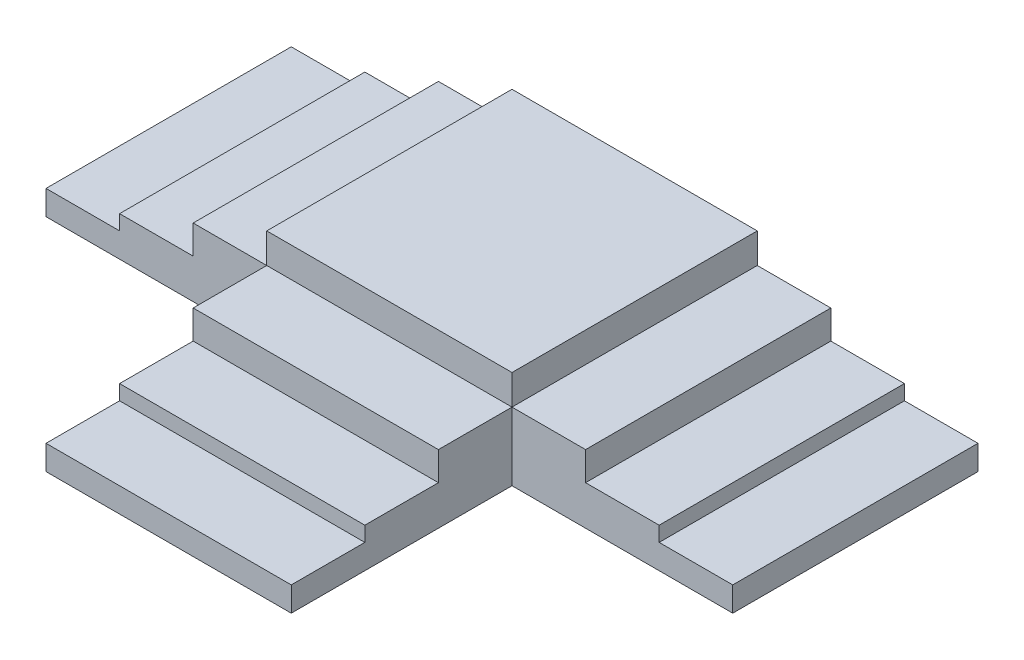
ISO-10303-21;
HEADER;
FILE_DESCRIPTION(('STEP AP214'),'2;1');
FILE_NAME('part.step','',(''),(''),'','','');
FILE_SCHEMA(('AUTOMOTIVE_DESIGN { 1 0 10303 214 1 1 1 1 }'));
ENDSEC;
DATA;
#1=APPLICATION_CONTEXT('core data for automotive mechanical design processes');
#2=APPLICATION_PROTOCOL_DEFINITION('international standard','automotive_design',2000,#1);
#3=PRODUCT_CONTEXT('',#1,'mechanical');
#4=PRODUCT('Part','Part','',(#3));
#5=PRODUCT_RELATED_PRODUCT_CATEGORY('part','',(#4));
#6=PRODUCT_DEFINITION_FORMATION('','',#4);
#7=PRODUCT_DEFINITION_CONTEXT('part definition',#1,'design');
#8=PRODUCT_DEFINITION('design','',#6,#7);
#9=PRODUCT_DEFINITION_SHAPE('','',#8);
#10=(LENGTH_UNIT() NAMED_UNIT(*) SI_UNIT(.MILLI.,.METRE.));
#11=(NAMED_UNIT(*) PLANE_ANGLE_UNIT() SI_UNIT($,.RADIAN.));
#12=(NAMED_UNIT(*) SI_UNIT($,.STERADIAN.) SOLID_ANGLE_UNIT());
#13=UNCERTAINTY_MEASURE_WITH_UNIT(LENGTH_MEASURE(1.E-05),#10,'distance_accuracy_value','');
#14=(GEOMETRIC_REPRESENTATION_CONTEXT(3) GLOBAL_UNCERTAINTY_ASSIGNED_CONTEXT((#13)) GLOBAL_UNIT_ASSIGNED_CONTEXT((#10,
#11,#12)) REPRESENTATION_CONTEXT('',''));
#15=CARTESIAN_POINT('',(0.,0.,0.));
#16=DIRECTION('',(0.,0.,1.));
#17=DIRECTION('',(1.,0.,0.));
#18=AXIS2_PLACEMENT_3D('',#15,#16,#17);
#19=CARTESIAN_POINT('',(500.,400.,-500.));
#20=DIRECTION('',(-1.,0.,0.));
#21=DIRECTION('',(0.,0.,1.));
#22=AXIS2_PLACEMENT_3D('',#19,#20,#21);
#23=PLANE('',#22);
#24=DIRECTION('',(0.,-1.,0.));
#25=VECTOR('',#24,1.);
#26=CARTESIAN_POINT('',(500.,277.753844898,500.));
#27=LINE('',#26,#25);
#28=CARTESIAN_POINT('',(500.,277.753844898,500.));
#29=VERTEX_POINT('',#28);
#30=CARTESIAN_POINT('',(500.,0.,500.));
#31=VERTEX_POINT('',#30);
#32=EDGE_CURVE('E228',#29,#31,#27,.T.);
#33=ORIENTED_EDGE('',*,*,#32,.F.);
#34=DIRECTION('',(0.,0.,1.));
#35=VECTOR('',#34,1.);
#36=CARTESIAN_POINT('',(500.,277.753844898,800.));
#37=LINE('',#36,#35);
#38=CARTESIAN_POINT('',(500.,277.753844898,800.));
#39=VERTEX_POINT('',#38);
#40=EDGE_CURVE('E284',#29,#39,#37,.T.);
#41=ORIENTED_EDGE('',*,*,#40,.T.);
#42=DIRECTION('',(0.,-1.,0.));
#43=VECTOR('',#42,1.);
#44=CARTESIAN_POINT('',(500.,160.85496084446,800.));
#45=LINE('',#44,#43);
#46=CARTESIAN_POINT('',(500.,160.85496084446,800.));
#47=VERTEX_POINT('',#46);
#48=EDGE_CURVE('E281',#39,#47,#45,.T.);
#49=ORIENTED_EDGE('',*,*,#48,.T.);
#50=DIRECTION('',(0.,0.,1.));
#51=VECTOR('',#50,1.);
#52=CARTESIAN_POINT('',(500.,160.85496084446,1100.));
#53=LINE('',#52,#51);
#54=CARTESIAN_POINT('',(500.,160.85496084446,1100.));
#55=VERTEX_POINT('',#54);
#56=EDGE_CURVE('E278',#47,#55,#53,.T.);
#57=ORIENTED_EDGE('',*,*,#56,.T.);
#58=DIRECTION('',(0.,-1.,0.));
#59=VECTOR('',#58,1.);
#60=CARTESIAN_POINT('',(500.,100.,1100.));
#61=LINE('',#60,#59);
#62=CARTESIAN_POINT('',(500.,100.,1100.));
#63=VERTEX_POINT('',#62);
#64=EDGE_CURVE('E275',#55,#63,#61,.T.);
#65=ORIENTED_EDGE('',*,*,#64,.T.);
#66=DIRECTION('',(0.,0.,1.));
#67=VECTOR('',#66,1.);
#68=CARTESIAN_POINT('',(500.,100.,1400.));
#69=LINE('',#68,#67);
#70=CARTESIAN_POINT('',(500.,100.,1400.));
#71=VERTEX_POINT('',#70);
#72=EDGE_CURVE('E271',#63,#71,#69,.T.);
#73=ORIENTED_EDGE('',*,*,#72,.T.);
#74=DIRECTION('',(0.,-1.,0.));
#75=VECTOR('',#74,1.);
#76=CARTESIAN_POINT('',(500.,0.,1400.));
#77=LINE('',#76,#75);
#78=CARTESIAN_POINT('',(500.,0.,1400.));
#79=VERTEX_POINT('',#78);
#80=EDGE_CURVE('E268',#71,#79,#77,.T.);
#81=ORIENTED_EDGE('',*,*,#80,.T.);
#82=DIRECTION('',(0.,0.,-1.));
#83=VECTOR('',#82,1.);
#84=CARTESIAN_POINT('',(500.,0.,-500.));
#85=LINE('',#84,#83);
#86=EDGE_CURVE('E67',#79,#31,#85,.T.);
#87=ORIENTED_EDGE('',*,*,#86,.T.);
#88=EDGE_LOOP('',(#33,#41,#49,#57,#65,#73,#81,#87));
#89=FACE_BOUND('',#88,.T.);
#90=ADVANCED_FACE('F45',(#89),#23,.F.);
#91=DIRECTION('',(0.,0.,1.));
#92=VECTOR('',#91,1.);
#93=CARTESIAN_POINT('',(500.,277.753844898,-1441.88491778753));
#94=LINE('',#93,#92);
#95=CARTESIAN_POINT('',(500.,277.753844898,-500.));
#96=VERTEX_POINT('',#95);
#97=EDGE_CURVE('E60',#96,#29,#94,.T.);
#98=ORIENTED_EDGE('',*,*,#97,.F.);
#99=DIRECTION('',(0.,-1.,0.));
#100=VECTOR('',#99,1.);
#101=CARTESIAN_POINT('',(500.,400.,-500.));
#102=LINE('',#101,#100);
#103=CARTESIAN_POINT('',(500.,400.,-500.));
#104=VERTEX_POINT('',#103);
#105=EDGE_CURVE('E11',#104,#96,#102,.T.);
#106=ORIENTED_EDGE('',*,*,#105,.F.);
#107=DIRECTION('',(0.,0.,-1.));
#108=VECTOR('',#107,1.);
#109=CARTESIAN_POINT('',(500.,400.,-500.));
#110=LINE('',#109,#108);
#111=CARTESIAN_POINT('',(500.,400.,500.));
#112=VERTEX_POINT('',#111);
#113=EDGE_CURVE('E406',#112,#104,#110,.T.);
#114=ORIENTED_EDGE('',*,*,#113,.F.);
#115=DIRECTION('',(0.,-1.,0.));
#116=VECTOR('',#115,1.);
#117=CARTESIAN_POINT('',(500.,400.,500.));
#118=LINE('',#117,#116);
#119=EDGE_CURVE('E420',#112,#29,#118,.T.);
#120=ORIENTED_EDGE('',*,*,#119,.T.);
#121=EDGE_LOOP('',(#98,#106,#114,#120));
#122=FACE_BOUND('',#121,.T.);
#123=ADVANCED_FACE('F537',(#122),#23,.F.);
#124=CARTESIAN_POINT('',(-500.,400.,500.));
#125=DIRECTION('',(0.,0.,-1.));
#126=DIRECTION('',(-1.,0.,0.));
#127=AXIS2_PLACEMENT_3D('',#124,#125,#126);
#128=PLANE('',#127);
#129=DIRECTION('',(0.,-1.,0.));
#130=VECTOR('',#129,1.);
#131=CARTESIAN_POINT('',(-500.,277.753844898,500.));
#132=LINE('',#131,#130);
#133=CARTESIAN_POINT('',(-500.,277.753844898,500.));
#134=VERTEX_POINT('',#133);
#135=CARTESIAN_POINT('',(-500.,0.,500.));
#136=VERTEX_POINT('',#135);
#137=EDGE_CURVE('E288',#134,#136,#132,.T.);
#138=ORIENTED_EDGE('',*,*,#137,.F.);
#139=DIRECTION('',(-1.,0.,0.));
#140=VECTOR('',#139,1.);
#141=CARTESIAN_POINT('',(-800.,277.753844898,500.));
#142=LINE('',#141,#140);
#143=CARTESIAN_POINT('',(-800.,277.753844898,500.));
#144=VERTEX_POINT('',#143);
#145=EDGE_CURVE('E359',#134,#144,#142,.T.);
#146=ORIENTED_EDGE('',*,*,#145,.T.);
#147=DIRECTION('',(0.,-1.,0.));
#148=VECTOR('',#147,1.);
#149=CARTESIAN_POINT('',(-800.,160.85496084446,500.));
#150=LINE('',#149,#148);
#151=CARTESIAN_POINT('',(-800.,160.85496084446,500.));
#152=VERTEX_POINT('',#151);
#153=EDGE_CURVE('E356',#144,#152,#150,.T.);
#154=ORIENTED_EDGE('',*,*,#153,.T.);
#155=DIRECTION('',(-1.,0.,0.));
#156=VECTOR('',#155,1.);
#157=CARTESIAN_POINT('',(-1100.,160.85496084446,500.));
#158=LINE('',#157,#156);
#159=CARTESIAN_POINT('',(-1100.,160.85496084446,500.));
#160=VERTEX_POINT('',#159);
#161=EDGE_CURVE('E353',#152,#160,#158,.T.);
#162=ORIENTED_EDGE('',*,*,#161,.T.);
#163=DIRECTION('',(0.,-1.,0.));
#164=VECTOR('',#163,1.);
#165=CARTESIAN_POINT('',(-1100.,100.,500.));
#166=LINE('',#165,#164);
#167=CARTESIAN_POINT('',(-1100.,100.,500.));
#168=VERTEX_POINT('',#167);
#169=EDGE_CURVE('E350',#160,#168,#166,.T.);
#170=ORIENTED_EDGE('',*,*,#169,.T.);
#171=DIRECTION('',(-1.,0.,0.));
#172=VECTOR('',#171,1.);
#173=CARTESIAN_POINT('',(-1400.,100.,500.));
#174=LINE('',#173,#172);
#175=CARTESIAN_POINT('',(-1400.,100.,500.));
#176=VERTEX_POINT('',#175);
#177=EDGE_CURVE('E346',#168,#176,#174,.T.);
#178=ORIENTED_EDGE('',*,*,#177,.T.);
#179=DIRECTION('',(0.,-1.,0.));
#180=VECTOR('',#179,1.);
#181=CARTESIAN_POINT('',(-1400.,0.,500.));
#182=LINE('',#181,#180);
#183=CARTESIAN_POINT('',(-1400.,0.,500.));
#184=VERTEX_POINT('',#183);
#185=EDGE_CURVE('E342',#176,#184,#182,.T.);
#186=ORIENTED_EDGE('',*,*,#185,.T.);
#187=DIRECTION('',(1.,0.,0.));
#188=VECTOR('',#187,1.);
#189=CARTESIAN_POINT('',(-500.,0.,500.));
#190=LINE('',#189,#188);
#191=EDGE_CURVE('E411',#184,#136,#190,.T.);
#192=ORIENTED_EDGE('',*,*,#191,.T.);
#193=EDGE_LOOP('',(#138,#146,#154,#162,#170,#178,#186,#192));
#194=FACE_BOUND('',#193,.T.);
#195=ADVANCED_FACE('F454',(#194),#128,.F.);
#196=DIRECTION('',(-1.,0.,0.));
#197=VECTOR('',#196,1.);
#198=CARTESIAN_POINT('',(1441.88491778753,277.753844898,500.));
#199=LINE('',#198,#197);
#200=EDGE_CURVE('E272',#29,#134,#199,.T.);
#201=ORIENTED_EDGE('',*,*,#200,.F.);
#202=ORIENTED_EDGE('',*,*,#119,.F.);
#203=DIRECTION('',(1.,0.,0.));
#204=VECTOR('',#203,1.);
#205=CARTESIAN_POINT('',(-500.,400.,500.));
#206=LINE('',#205,#204);
#207=CARTESIAN_POINT('',(-500.,400.,500.));
#208=VERTEX_POINT('',#207);
#209=EDGE_CURVE('E417',#208,#112,#206,.T.);
#210=ORIENTED_EDGE('',*,*,#209,.F.);
#211=DIRECTION('',(0.,-1.,0.));
#212=VECTOR('',#211,1.);
#213=CARTESIAN_POINT('',(-500.,400.,500.));
#214=LINE('',#213,#212);
#215=EDGE_CURVE('E429',#208,#134,#214,.T.);
#216=ORIENTED_EDGE('',*,*,#215,.T.);
#217=EDGE_LOOP('',(#201,#202,#210,#216));
#218=FACE_BOUND('',#217,.T.);
#219=ADVANCED_FACE('F486',(#218),#128,.F.);
#220=CARTESIAN_POINT('',(-500.,400.,-500.));
#221=DIRECTION('',(1.,0.,0.));
#222=DIRECTION('',(0.,0.,-1.));
#223=AXIS2_PLACEMENT_3D('',#220,#221,#222);
#224=PLANE('',#223);
#225=DIRECTION('',(0.,0.,-1.));
#226=VECTOR('',#225,1.);
#227=CARTESIAN_POINT('',(-500.,277.753844898,1441.88491778753));
#228=LINE('',#227,#226);
#229=CARTESIAN_POINT('',(-500.,277.753844898,-500.));
#230=VERTEX_POINT('',#229);
#231=EDGE_CURVE('E347',#134,#230,#228,.T.);
#232=ORIENTED_EDGE('',*,*,#231,.F.);
#233=ORIENTED_EDGE('',*,*,#215,.F.);
#234=DIRECTION('',(0.,0.,1.));
#235=VECTOR('',#234,1.);
#236=CARTESIAN_POINT('',(-500.,400.,-500.));
#237=LINE('',#236,#235);
#238=CARTESIAN_POINT('',(-500.,400.,-500.));
#239=VERTEX_POINT('',#238);
#240=EDGE_CURVE('E414',#239,#208,#237,.T.);
#241=ORIENTED_EDGE('',*,*,#240,.F.);
#242=DIRECTION('',(0.,-1.,0.));
#243=VECTOR('',#242,1.);
#244=CARTESIAN_POINT('',(-500.,400.,-500.));
#245=LINE('',#244,#243);
#246=EDGE_CURVE('E53',#239,#230,#245,.T.);
#247=ORIENTED_EDGE('',*,*,#246,.T.);
#248=EDGE_LOOP('',(#232,#233,#241,#247));
#249=FACE_BOUND('',#248,.T.);
#250=ADVANCED_FACE('F437',(#249),#224,.F.);
#251=CARTESIAN_POINT('',(-500.,400.,-500.));
#252=DIRECTION('',(0.,0.,1.));
#253=DIRECTION('',(1.,0.,0.));
#254=AXIS2_PLACEMENT_3D('',#251,#252,#253);
#255=PLANE('',#254);
#256=DIRECTION('',(-1.,0.,0.));
#257=VECTOR('',#256,1.);
#258=CARTESIAN_POINT('',(-500.,0.,-500.));
#259=LINE('',#258,#257);
#260=CARTESIAN_POINT('',(1400.,0.,-500.));
#261=VERTEX_POINT('',#260);
#262=CARTESIAN_POINT('',(-1400.,0.,-500.));
#263=VERTEX_POINT('',#262);
#264=EDGE_CURVE('E208',#261,#263,#259,.T.);
#265=ORIENTED_EDGE('',*,*,#264,.T.);
#266=DIRECTION('',(0.,1.,0.));
#267=VECTOR('',#266,1.);
#268=CARTESIAN_POINT('',(-1400.,0.,-500.));
#269=LINE('',#268,#267);
#270=CARTESIAN_POINT('',(-1400.,100.,-500.));
#271=VERTEX_POINT('',#270);
#272=EDGE_CURVE('E287',#263,#271,#269,.T.);
#273=ORIENTED_EDGE('',*,*,#272,.T.);
#274=DIRECTION('',(1.,0.,0.));
#275=VECTOR('',#274,1.);
#276=CARTESIAN_POINT('',(-1400.,100.,-500.));
#277=LINE('',#276,#275);
#278=CARTESIAN_POINT('',(-1100.,100.,-500.));
#279=VERTEX_POINT('',#278);
#280=EDGE_CURVE('E365',#271,#279,#277,.T.);
#281=ORIENTED_EDGE('',*,*,#280,.T.);
#282=DIRECTION('',(0.,1.,0.));
#283=VECTOR('',#282,1.);
#284=CARTESIAN_POINT('',(-1100.,100.,-500.));
#285=LINE('',#284,#283);
#286=CARTESIAN_POINT('',(-1100.,160.85496084446,-500.));
#287=VERTEX_POINT('',#286);
#288=EDGE_CURVE('E369',#279,#287,#285,.T.);
#289=ORIENTED_EDGE('',*,*,#288,.T.);
#290=DIRECTION('',(1.,0.,0.));
#291=VECTOR('',#290,1.);
#292=CARTESIAN_POINT('',(-1100.,160.85496084446,-500.));
#293=LINE('',#292,#291);
#294=CARTESIAN_POINT('',(-800.,160.85496084446,-500.));
#295=VERTEX_POINT('',#294);
#296=EDGE_CURVE('E373',#287,#295,#293,.T.);
#297=ORIENTED_EDGE('',*,*,#296,.T.);
#298=DIRECTION('',(0.,1.,0.));
#299=VECTOR('',#298,1.);
#300=CARTESIAN_POINT('',(-800.,160.85496084446,-500.));
#301=LINE('',#300,#299);
#302=CARTESIAN_POINT('',(-800.,277.753844898,-500.));
#303=VERTEX_POINT('',#302);
#304=EDGE_CURVE('E377',#295,#303,#301,.T.);
#305=ORIENTED_EDGE('',*,*,#304,.T.);
#306=DIRECTION('',(1.,0.,0.));
#307=VECTOR('',#306,1.);
#308=CARTESIAN_POINT('',(-800.,277.753844898,-500.));
#309=LINE('',#308,#307);
#310=EDGE_CURVE('E381',#303,#230,#309,.T.);
#311=ORIENTED_EDGE('',*,*,#310,.T.);
#312=ORIENTED_EDGE('',*,*,#246,.F.);
#313=DIRECTION('',(-1.,0.,0.));
#314=VECTOR('',#313,1.);
#315=CARTESIAN_POINT('',(-500.,400.,-500.));
#316=LINE('',#315,#314);
#317=EDGE_CURVE('E410',#104,#239,#316,.T.);
#318=ORIENTED_EDGE('',*,*,#317,.F.);
#319=ORIENTED_EDGE('',*,*,#105,.T.);
#320=DIRECTION('',(1.,0.,0.));
#321=VECTOR('',#320,1.);
#322=CARTESIAN_POINT('',(800.,277.753844898,-500.));
#323=LINE('',#322,#321);
#324=CARTESIAN_POINT('',(800.,277.753844898,-500.));
#325=VERTEX_POINT('',#324);
#326=EDGE_CURVE('E293',#96,#325,#323,.T.);
#327=ORIENTED_EDGE('',*,*,#326,.T.);
#328=DIRECTION('',(0.,-1.,0.));
#329=VECTOR('',#328,1.);
#330=CARTESIAN_POINT('',(800.,160.85496084446,-500.));
#331=LINE('',#330,#329);
#332=CARTESIAN_POINT('',(800.,160.85496084446,-500.));
#333=VERTEX_POINT('',#332);
#334=EDGE_CURVE('E501',#325,#333,#331,.T.);
#335=ORIENTED_EDGE('',*,*,#334,.T.);
#336=DIRECTION('',(1.,0.,0.));
#337=VECTOR('',#336,1.);
#338=CARTESIAN_POINT('',(1100.,160.85496084446,-500.));
#339=LINE('',#338,#337);
#340=CARTESIAN_POINT('',(1100.,160.85496084446,-500.));
#341=VERTEX_POINT('',#340);
#342=EDGE_CURVE('E504',#333,#341,#339,.T.);
#343=ORIENTED_EDGE('',*,*,#342,.T.);
#344=DIRECTION('',(0.,-1.,0.));
#345=VECTOR('',#344,1.);
#346=CARTESIAN_POINT('',(1100.,100.,-500.));
#347=LINE('',#346,#345);
#348=CARTESIAN_POINT('',(1100.,100.,-500.));
#349=VERTEX_POINT('',#348);
#350=EDGE_CURVE('E508',#341,#349,#347,.T.);
#351=ORIENTED_EDGE('',*,*,#350,.T.);
#352=DIRECTION('',(1.,0.,0.));
#353=VECTOR('',#352,1.);
#354=CARTESIAN_POINT('',(1400.,100.,-500.));
#355=LINE('',#354,#353);
#356=CARTESIAN_POINT('',(1400.,100.,-500.));
#357=VERTEX_POINT('',#356);
#358=EDGE_CURVE('E513',#349,#357,#355,.T.);
#359=ORIENTED_EDGE('',*,*,#358,.T.);
#360=DIRECTION('',(0.,-1.,0.));
#361=VECTOR('',#360,1.);
#362=CARTESIAN_POINT('',(1400.,0.,-500.));
#363=LINE('',#362,#361);
#364=EDGE_CURVE('E253',#357,#261,#363,.T.);
#365=ORIENTED_EDGE('',*,*,#364,.T.);
#366=EDGE_LOOP('',(#265,#273,#281,#289,#297,#305,#311,#312,#318,#319,#327,#335,#343,#351,#359,#365));
#367=FACE_BOUND('',#366,.T.);
#368=ADVANCED_FACE('F445',(#367),#255,.F.);
#369=CARTESIAN_POINT('',(0.,400.,0.));
#370=DIRECTION('',(0.,1.,0.));
#371=DIRECTION('',(0.,0.,1.));
#372=AXIS2_PLACEMENT_3D('',#369,#370,#371);
#373=PLANE('',#372);
#374=ORIENTED_EDGE('',*,*,#113,.T.);
#375=ORIENTED_EDGE('',*,*,#317,.T.);
#376=ORIENTED_EDGE('',*,*,#240,.T.);
#377=ORIENTED_EDGE('',*,*,#209,.T.);
#378=EDGE_LOOP('',(#374,#375,#376,#377));
#379=FACE_BOUND('',#378,.T.);
#380=ADVANCED_FACE('F555',(#379),#373,.T.);
#381=CARTESIAN_POINT('',(0.,0.,0.));
#382=DIRECTION('',(0.,1.,0.));
#383=DIRECTION('',(0.,0.,1.));
#384=AXIS2_PLACEMENT_3D('',#381,#382,#383);
#385=PLANE('',#384);
#386=ORIENTED_EDGE('',*,*,#86,.F.);
#387=DIRECTION('',(-1.,0.,0.));
#388=VECTOR('',#387,1.);
#389=CARTESIAN_POINT('',(1441.88491778753,0.,1400.));
#390=LINE('',#389,#388);
#391=CARTESIAN_POINT('',(-500.,0.,1400.));
#392=VERTEX_POINT('',#391);
#393=EDGE_CURVE('E321',#79,#392,#390,.T.);
#394=ORIENTED_EDGE('',*,*,#393,.T.);
#395=DIRECTION('',(0.,0.,1.));
#396=VECTOR('',#395,1.);
#397=CARTESIAN_POINT('',(-500.,0.,500.));
#398=LINE('',#397,#396);
#399=EDGE_CURVE('E292',#136,#392,#398,.T.);
#400=ORIENTED_EDGE('',*,*,#399,.F.);
#401=ORIENTED_EDGE('',*,*,#191,.F.);
#402=DIRECTION('',(0.,0.,-1.));
#403=VECTOR('',#402,1.);
#404=CARTESIAN_POINT('',(-1400.,0.,1441.88491778753));
#405=LINE('',#404,#403);
#406=EDGE_CURVE('E385',#184,#263,#405,.T.);
#407=ORIENTED_EDGE('',*,*,#406,.T.);
#408=ORIENTED_EDGE('',*,*,#264,.F.);
#409=DIRECTION('',(0.,0.,1.));
#410=VECTOR('',#409,1.);
#411=CARTESIAN_POINT('',(1400.,0.,-1441.88491778753));
#412=LINE('',#411,#410);
#413=CARTESIAN_POINT('',(1400.,0.,500.));
#414=VERTEX_POINT('',#413);
#415=EDGE_CURVE('E201',#261,#414,#412,.T.);
#416=ORIENTED_EDGE('',*,*,#415,.T.);
#417=DIRECTION('',(1.,0.,0.));
#418=VECTOR('',#417,1.);
#419=CARTESIAN_POINT('',(500.,0.,500.));
#420=LINE('',#419,#418);
#421=EDGE_CURVE('E205',#31,#414,#420,.T.);
#422=ORIENTED_EDGE('',*,*,#421,.F.);
#423=EDGE_LOOP('',(#386,#394,#400,#401,#407,#408,#416,#422));
#424=FACE_BOUND('',#423,.T.);
#425=ADVANCED_FACE('F203',(#424),#385,.F.);
#426=CARTESIAN_POINT('',(-800.,277.753844898,1441.88491778753));
#427=DIRECTION('',(0.,1.,0.));
#428=DIRECTION('',(0.,0.,1.));
#429=AXIS2_PLACEMENT_3D('',#426,#427,#428);
#430=PLANE('',#429);
#431=ORIENTED_EDGE('',*,*,#145,.F.);
#432=ORIENTED_EDGE('',*,*,#231,.T.);
#433=ORIENTED_EDGE('',*,*,#310,.F.);
#434=DIRECTION('',(0.,0.,-1.));
#435=VECTOR('',#434,1.);
#436=CARTESIAN_POINT('',(-800.,277.753844898,1441.88491778753));
#437=LINE('',#436,#435);
#438=EDGE_CURVE('E389',#144,#303,#437,.T.);
#439=ORIENTED_EDGE('',*,*,#438,.F.);
#440=EDGE_LOOP('',(#431,#432,#433,#439));
#441=FACE_BOUND('',#440,.T.);
#442=ADVANCED_FACE('F443',(#441),#430,.T.);
#443=CARTESIAN_POINT('',(-800.,160.85496084446,1441.88491778753));
#444=DIRECTION('',(-1.,0.,0.));
#445=DIRECTION('',(0.,0.,1.));
#446=AXIS2_PLACEMENT_3D('',#443,#444,#445);
#447=PLANE('',#446);
#448=ORIENTED_EDGE('',*,*,#153,.F.);
#449=ORIENTED_EDGE('',*,*,#438,.T.);
#450=ORIENTED_EDGE('',*,*,#304,.F.);
#451=DIRECTION('',(0.,0.,-1.));
#452=VECTOR('',#451,1.);
#453=CARTESIAN_POINT('',(-800.,160.85496084446,1441.88491778753));
#454=LINE('',#453,#452);
#455=EDGE_CURVE('E392',#152,#295,#454,.T.);
#456=ORIENTED_EDGE('',*,*,#455,.F.);
#457=EDGE_LOOP('',(#448,#449,#450,#456));
#458=FACE_BOUND('',#457,.T.);
#459=ADVANCED_FACE('F451',(#458),#447,.T.);
#460=CARTESIAN_POINT('',(-1100.,160.85496084446,1441.88491778753));
#461=DIRECTION('',(0.,1.,0.));
#462=DIRECTION('',(-1.,0.,0.));
#463=AXIS2_PLACEMENT_3D('',#460,#461,#462);
#464=PLANE('',#463);
#465=ORIENTED_EDGE('',*,*,#161,.F.);
#466=ORIENTED_EDGE('',*,*,#455,.T.);
#467=ORIENTED_EDGE('',*,*,#296,.F.);
#468=DIRECTION('',(0.,0.,-1.));
#469=VECTOR('',#468,1.);
#470=CARTESIAN_POINT('',(-1100.,160.85496084446,1441.88491778753));
#471=LINE('',#470,#469);
#472=EDGE_CURVE('E395',#160,#287,#471,.T.);
#473=ORIENTED_EDGE('',*,*,#472,.F.);
#474=EDGE_LOOP('',(#465,#466,#467,#473));
#475=FACE_BOUND('',#474,.T.);
#476=ADVANCED_FACE('F458',(#475),#464,.T.);
#477=CARTESIAN_POINT('',(-1100.,100.,1441.88491778753));
#478=DIRECTION('',(-1.,0.,0.));
#479=DIRECTION('',(0.,0.,1.));
#480=AXIS2_PLACEMENT_3D('',#477,#478,#479);
#481=PLANE('',#480);
#482=ORIENTED_EDGE('',*,*,#169,.F.);
#483=ORIENTED_EDGE('',*,*,#472,.T.);
#484=ORIENTED_EDGE('',*,*,#288,.F.);
#485=DIRECTION('',(0.,0.,-1.));
#486=VECTOR('',#485,1.);
#487=CARTESIAN_POINT('',(-1100.,100.,1441.88491778753));
#488=LINE('',#487,#486);
#489=EDGE_CURVE('E398',#168,#279,#488,.T.);
#490=ORIENTED_EDGE('',*,*,#489,.F.);
#491=EDGE_LOOP('',(#482,#483,#484,#490));
#492=FACE_BOUND('',#491,.T.);
#493=ADVANCED_FACE('F461',(#492),#481,.T.);
#494=CARTESIAN_POINT('',(-1400.,100.,1441.88491778753));
#495=DIRECTION('',(0.,1.,0.));
#496=DIRECTION('',(-1.,0.,0.));
#497=AXIS2_PLACEMENT_3D('',#494,#495,#496);
#498=PLANE('',#497);
#499=ORIENTED_EDGE('',*,*,#177,.F.);
#500=ORIENTED_EDGE('',*,*,#489,.T.);
#501=ORIENTED_EDGE('',*,*,#280,.F.);
#502=DIRECTION('',(0.,0.,-1.));
#503=VECTOR('',#502,1.);
#504=CARTESIAN_POINT('',(-1400.,100.,1441.88491778753));
#505=LINE('',#504,#503);
#506=EDGE_CURVE('E401',#176,#271,#505,.T.);
#507=ORIENTED_EDGE('',*,*,#506,.F.);
#508=EDGE_LOOP('',(#499,#500,#501,#507));
#509=FACE_BOUND('',#508,.T.);
#510=ADVANCED_FACE('F467',(#509),#498,.T.);
#511=CARTESIAN_POINT('',(-1400.,0.,1441.88491778753));
#512=DIRECTION('',(-1.,0.,0.));
#513=DIRECTION('',(0.,0.,1.));
#514=AXIS2_PLACEMENT_3D('',#511,#512,#513);
#515=PLANE('',#514);
#516=ORIENTED_EDGE('',*,*,#185,.F.);
#517=ORIENTED_EDGE('',*,*,#506,.T.);
#518=ORIENTED_EDGE('',*,*,#272,.F.);
#519=ORIENTED_EDGE('',*,*,#406,.F.);
#520=EDGE_LOOP('',(#516,#517,#518,#519));
#521=FACE_BOUND('',#520,.T.);
#522=ADVANCED_FACE('F471',(#521),#515,.T.);
#523=CARTESIAN_POINT('',(1441.88491778753,277.753844898,800.));
#524=DIRECTION('',(0.,1.,0.));
#525=DIRECTION('',(0.,0.,1.));
#526=AXIS2_PLACEMENT_3D('',#523,#524,#525);
#527=PLANE('',#526);
#528=ORIENTED_EDGE('',*,*,#40,.F.);
#529=ORIENTED_EDGE('',*,*,#200,.T.);
#530=DIRECTION('',(0.,0.,-1.));
#531=VECTOR('',#530,1.);
#532=CARTESIAN_POINT('',(-500.,277.753844898,800.));
#533=LINE('',#532,#531);
#534=CARTESIAN_POINT('',(-500.,277.753844898,800.));
#535=VERTEX_POINT('',#534);
#536=EDGE_CURVE('E317',#535,#134,#533,.T.);
#537=ORIENTED_EDGE('',*,*,#536,.F.);
#538=DIRECTION('',(-1.,0.,0.));
#539=VECTOR('',#538,1.);
#540=CARTESIAN_POINT('',(1441.88491778753,277.753844898,800.));
#541=LINE('',#540,#539);
#542=EDGE_CURVE('E325',#39,#535,#541,.T.);
#543=ORIENTED_EDGE('',*,*,#542,.F.);
#544=EDGE_LOOP('',(#528,#529,#537,#543));
#545=FACE_BOUND('',#544,.T.);
#546=ADVANCED_FACE('F482',(#545),#527,.T.);
#547=CARTESIAN_POINT('',(1441.88491778753,160.85496084446,800.));
#548=DIRECTION('',(0.,0.,1.));
#549=DIRECTION('',(1.,0.,0.));
#550=AXIS2_PLACEMENT_3D('',#547,#548,#549);
#551=PLANE('',#550);
#552=ORIENTED_EDGE('',*,*,#48,.F.);
#553=ORIENTED_EDGE('',*,*,#542,.T.);
#554=DIRECTION('',(0.,1.,0.));
#555=VECTOR('',#554,1.);
#556=CARTESIAN_POINT('',(-500.,160.85496084446,800.));
#557=LINE('',#556,#555);
#558=CARTESIAN_POINT('',(-500.,160.85496084446,800.));
#559=VERTEX_POINT('',#558);
#560=EDGE_CURVE('E313',#559,#535,#557,.T.);
#561=ORIENTED_EDGE('',*,*,#560,.F.);
#562=DIRECTION('',(-1.,0.,0.));
#563=VECTOR('',#562,1.);
#564=CARTESIAN_POINT('',(1441.88491778753,160.85496084446,800.));
#565=LINE('',#564,#563);
#566=EDGE_CURVE('E328',#47,#559,#565,.T.);
#567=ORIENTED_EDGE('',*,*,#566,.F.);
#568=EDGE_LOOP('',(#552,#553,#561,#567));
#569=FACE_BOUND('',#568,.T.);
#570=ADVANCED_FACE('F590',(#569),#551,.T.);
#571=CARTESIAN_POINT('',(1441.88491778753,160.85496084446,1100.));
#572=DIRECTION('',(0.,1.,0.));
#573=DIRECTION('',(0.,0.,1.));
#574=AXIS2_PLACEMENT_3D('',#571,#572,#573);
#575=PLANE('',#574);
#576=ORIENTED_EDGE('',*,*,#56,.F.);
#577=ORIENTED_EDGE('',*,*,#566,.T.);
#578=DIRECTION('',(0.,0.,-1.));
#579=VECTOR('',#578,1.);
#580=CARTESIAN_POINT('',(-500.,160.85496084446,1100.));
#581=LINE('',#580,#579);
#582=CARTESIAN_POINT('',(-500.,160.85496084446,1100.));
#583=VERTEX_POINT('',#582);
#584=EDGE_CURVE('E309',#583,#559,#581,.T.);
#585=ORIENTED_EDGE('',*,*,#584,.F.);
#586=DIRECTION('',(-1.,0.,0.));
#587=VECTOR('',#586,1.);
#588=CARTESIAN_POINT('',(1441.88491778753,160.85496084446,1100.));
#589=LINE('',#588,#587);
#590=EDGE_CURVE('E331',#55,#583,#589,.T.);
#591=ORIENTED_EDGE('',*,*,#590,.F.);
#592=EDGE_LOOP('',(#576,#577,#585,#591));
#593=FACE_BOUND('',#592,.T.);
#594=ADVANCED_FACE('F586',(#593),#575,.T.);
#595=CARTESIAN_POINT('',(1441.88491778753,100.,1100.));
#596=DIRECTION('',(0.,0.,1.));
#597=DIRECTION('',(1.,0.,0.));
#598=AXIS2_PLACEMENT_3D('',#595,#596,#597);
#599=PLANE('',#598);
#600=ORIENTED_EDGE('',*,*,#64,.F.);
#601=ORIENTED_EDGE('',*,*,#590,.T.);
#602=DIRECTION('',(0.,1.,0.));
#603=VECTOR('',#602,1.);
#604=CARTESIAN_POINT('',(-500.,100.,1100.));
#605=LINE('',#604,#603);
#606=CARTESIAN_POINT('',(-500.,100.,1100.));
#607=VERTEX_POINT('',#606);
#608=EDGE_CURVE('E305',#607,#583,#605,.T.);
#609=ORIENTED_EDGE('',*,*,#608,.F.);
#610=DIRECTION('',(-1.,0.,0.));
#611=VECTOR('',#610,1.);
#612=CARTESIAN_POINT('',(1441.88491778753,100.,1100.));
#613=LINE('',#612,#611);
#614=EDGE_CURVE('E334',#63,#607,#613,.T.);
#615=ORIENTED_EDGE('',*,*,#614,.F.);
#616=EDGE_LOOP('',(#600,#601,#609,#615));
#617=FACE_BOUND('',#616,.T.);
#618=ADVANCED_FACE('F582',(#617),#599,.T.);
#619=CARTESIAN_POINT('',(1441.88491778753,100.,1400.));
#620=DIRECTION('',(0.,1.,0.));
#621=DIRECTION('',(0.,0.,1.));
#622=AXIS2_PLACEMENT_3D('',#619,#620,#621);
#623=PLANE('',#622);
#624=ORIENTED_EDGE('',*,*,#72,.F.);
#625=ORIENTED_EDGE('',*,*,#614,.T.);
#626=DIRECTION('',(0.,0.,-1.));
#627=VECTOR('',#626,1.);
#628=CARTESIAN_POINT('',(-500.,100.,1400.));
#629=LINE('',#628,#627);
#630=CARTESIAN_POINT('',(-500.,100.,1400.));
#631=VERTEX_POINT('',#630);
#632=EDGE_CURVE('E301',#631,#607,#629,.T.);
#633=ORIENTED_EDGE('',*,*,#632,.F.);
#634=DIRECTION('',(-1.,0.,0.));
#635=VECTOR('',#634,1.);
#636=CARTESIAN_POINT('',(1441.88491778753,100.,1400.));
#637=LINE('',#636,#635);
#638=EDGE_CURVE('E337',#71,#631,#637,.T.);
#639=ORIENTED_EDGE('',*,*,#638,.F.);
#640=EDGE_LOOP('',(#624,#625,#633,#639));
#641=FACE_BOUND('',#640,.T.);
#642=ADVANCED_FACE('F578',(#641),#623,.T.);
#643=CARTESIAN_POINT('',(1441.88491778753,0.,1400.));
#644=DIRECTION('',(0.,0.,1.));
#645=DIRECTION('',(1.,0.,0.));
#646=AXIS2_PLACEMENT_3D('',#643,#644,#645);
#647=PLANE('',#646);
#648=ORIENTED_EDGE('',*,*,#80,.F.);
#649=ORIENTED_EDGE('',*,*,#638,.T.);
#650=DIRECTION('',(0.,1.,0.));
#651=VECTOR('',#650,1.);
#652=CARTESIAN_POINT('',(-500.,0.,1400.));
#653=LINE('',#652,#651);
#654=EDGE_CURVE('E297',#392,#631,#653,.T.);
#655=ORIENTED_EDGE('',*,*,#654,.F.);
#656=ORIENTED_EDGE('',*,*,#393,.F.);
#657=EDGE_LOOP('',(#648,#649,#655,#656));
#658=FACE_BOUND('',#657,.T.);
#659=ADVANCED_FACE('F575',(#658),#647,.T.);
#660=CARTESIAN_POINT('',(-500.,0.,1.2335811384724E-13));
#661=DIRECTION('',(-1.,0.,0.));
#662=DIRECTION('',(0.,0.,1.));
#663=AXIS2_PLACEMENT_3D('',#660,#661,#662);
#664=PLANE('',#663);
#665=ORIENTED_EDGE('',*,*,#137,.T.);
#666=ORIENTED_EDGE('',*,*,#399,.T.);
#667=ORIENTED_EDGE('',*,*,#654,.T.);
#668=ORIENTED_EDGE('',*,*,#632,.T.);
#669=ORIENTED_EDGE('',*,*,#608,.T.);
#670=ORIENTED_EDGE('',*,*,#584,.T.);
#671=ORIENTED_EDGE('',*,*,#560,.T.);
#672=ORIENTED_EDGE('',*,*,#536,.T.);
#673=EDGE_LOOP('',(#665,#666,#667,#668,#669,#670,#671,#672));
#674=FACE_BOUND('',#673,.T.);
#675=ADVANCED_FACE('F477',(#674),#664,.T.);
#676=CARTESIAN_POINT('',(800.,277.753844898,-1441.88491778753));
#677=DIRECTION('',(0.,1.,0.));
#678=DIRECTION('',(-1.,0.,0.));
#679=AXIS2_PLACEMENT_3D('',#676,#677,#678);
#680=PLANE('',#679);
#681=ORIENTED_EDGE('',*,*,#326,.F.);
#682=ORIENTED_EDGE('',*,*,#97,.T.);
#683=DIRECTION('',(-1.,0.,0.));
#684=VECTOR('',#683,1.);
#685=CARTESIAN_POINT('',(800.,277.753844898,500.));
#686=LINE('',#685,#684);
#687=CARTESIAN_POINT('',(800.,277.753844898,500.));
#688=VERTEX_POINT('',#687);
#689=EDGE_CURVE('E214',#688,#29,#686,.T.);
#690=ORIENTED_EDGE('',*,*,#689,.F.);
#691=DIRECTION('',(0.,0.,1.));
#692=VECTOR('',#691,1.);
#693=CARTESIAN_POINT('',(800.,277.753844898,-1441.88491778753));
#694=LINE('',#693,#692);
#695=EDGE_CURVE('E254',#325,#688,#694,.T.);
#696=ORIENTED_EDGE('',*,*,#695,.F.);
#697=EDGE_LOOP('',(#681,#682,#690,#696));
#698=FACE_BOUND('',#697,.T.);
#699=ADVANCED_FACE('F493',(#698),#680,.T.);
#700=CARTESIAN_POINT('',(800.,160.85496084446,-1441.88491778753));
#701=DIRECTION('',(1.,0.,0.));
#702=DIRECTION('',(0.,0.,-1.));
#703=AXIS2_PLACEMENT_3D('',#700,#701,#702);
#704=PLANE('',#703);
#705=ORIENTED_EDGE('',*,*,#334,.F.);
#706=ORIENTED_EDGE('',*,*,#695,.T.);
#707=DIRECTION('',(0.,1.,0.));
#708=VECTOR('',#707,1.);
#709=CARTESIAN_POINT('',(800.,160.85496084446,500.));
#710=LINE('',#709,#708);
#711=CARTESIAN_POINT('',(800.,160.85496084446,500.));
#712=VERTEX_POINT('',#711);
#713=EDGE_CURVE('E245',#712,#688,#710,.T.);
#714=ORIENTED_EDGE('',*,*,#713,.F.);
#715=DIRECTION('',(0.,0.,1.));
#716=VECTOR('',#715,1.);
#717=CARTESIAN_POINT('',(800.,160.85496084446,-1441.88491778753));
#718=LINE('',#717,#716);
#719=EDGE_CURVE('E257',#333,#712,#718,.T.);
#720=ORIENTED_EDGE('',*,*,#719,.F.);
#721=EDGE_LOOP('',(#705,#706,#714,#720));
#722=FACE_BOUND('',#721,.T.);
#723=ADVANCED_FACE('F500',(#722),#704,.T.);
#724=CARTESIAN_POINT('',(1100.,160.85496084446,-1441.88491778753));
#725=DIRECTION('',(0.,1.,0.));
#726=DIRECTION('',(-1.,0.,0.));
#727=AXIS2_PLACEMENT_3D('',#724,#725,#726);
#728=PLANE('',#727);
#729=ORIENTED_EDGE('',*,*,#342,.F.);
#730=ORIENTED_EDGE('',*,*,#719,.T.);
#731=DIRECTION('',(-1.,0.,0.));
#732=VECTOR('',#731,1.);
#733=CARTESIAN_POINT('',(1100.,160.85496084446,500.));
#734=LINE('',#733,#732);
#735=CARTESIAN_POINT('',(1100.,160.85496084446,500.));
#736=VERTEX_POINT('',#735);
#737=EDGE_CURVE('E241',#736,#712,#734,.T.);
#738=ORIENTED_EDGE('',*,*,#737,.F.);
#739=DIRECTION('',(0.,0.,1.));
#740=VECTOR('',#739,1.);
#741=CARTESIAN_POINT('',(1100.,160.85496084446,-1441.88491778753));
#742=LINE('',#741,#740);
#743=EDGE_CURVE('E260',#341,#736,#742,.T.);
#744=ORIENTED_EDGE('',*,*,#743,.F.);
#745=EDGE_LOOP('',(#729,#730,#738,#744));
#746=FACE_BOUND('',#745,.T.);
#747=ADVANCED_FACE('F527',(#746),#728,.T.);
#748=CARTESIAN_POINT('',(1100.,100.,-1441.88491778753));
#749=DIRECTION('',(1.,0.,0.));
#750=DIRECTION('',(0.,1.,0.));
#751=AXIS2_PLACEMENT_3D('',#748,#749,#750);
#752=PLANE('',#751);
#753=ORIENTED_EDGE('',*,*,#350,.F.);
#754=ORIENTED_EDGE('',*,*,#743,.T.);
#755=DIRECTION('',(0.,1.,0.));
#756=VECTOR('',#755,1.);
#757=CARTESIAN_POINT('',(1100.,100.,500.));
#758=LINE('',#757,#756);
#759=CARTESIAN_POINT('',(1100.,100.,500.));
#760=VERTEX_POINT('',#759);
#761=EDGE_CURVE('E237',#760,#736,#758,.T.);
#762=ORIENTED_EDGE('',*,*,#761,.F.);
#763=DIRECTION('',(0.,0.,1.));
#764=VECTOR('',#763,1.);
#765=CARTESIAN_POINT('',(1100.,100.,-1441.88491778753));
#766=LINE('',#765,#764);
#767=EDGE_CURVE('E263',#349,#760,#766,.T.);
#768=ORIENTED_EDGE('',*,*,#767,.F.);
#769=EDGE_LOOP('',(#753,#754,#762,#768));
#770=FACE_BOUND('',#769,.T.);
#771=ADVANCED_FACE('F524',(#770),#752,.T.);
#772=CARTESIAN_POINT('',(1400.,100.,-1441.88491778753));
#773=DIRECTION('',(0.,1.,0.));
#774=DIRECTION('',(-1.,0.,0.));
#775=AXIS2_PLACEMENT_3D('',#772,#773,#774);
#776=PLANE('',#775);
#777=ORIENTED_EDGE('',*,*,#358,.F.);
#778=ORIENTED_EDGE('',*,*,#767,.T.);
#779=DIRECTION('',(-1.,0.,0.));
#780=VECTOR('',#779,1.);
#781=CARTESIAN_POINT('',(1400.,100.,500.));
#782=LINE('',#781,#780);
#783=CARTESIAN_POINT('',(1400.,100.,500.));
#784=VERTEX_POINT('',#783);
#785=EDGE_CURVE('E224',#784,#760,#782,.T.);
#786=ORIENTED_EDGE('',*,*,#785,.F.);
#787=DIRECTION('',(0.,0.,1.));
#788=VECTOR('',#787,1.);
#789=CARTESIAN_POINT('',(1400.,100.,-1441.88491778753));
#790=LINE('',#789,#788);
#791=EDGE_CURVE('E213',#357,#784,#790,.T.);
#792=ORIENTED_EDGE('',*,*,#791,.F.);
#793=EDGE_LOOP('',(#777,#778,#786,#792));
#794=FACE_BOUND('',#793,.T.);
#795=ADVANCED_FACE('F519',(#794),#776,.T.);
#796=CARTESIAN_POINT('',(1400.,0.,-1441.88491778753));
#797=DIRECTION('',(1.,0.,0.));
#798=DIRECTION('',(0.,0.,-1.));
#799=AXIS2_PLACEMENT_3D('',#796,#797,#798);
#800=PLANE('',#799);
#801=ORIENTED_EDGE('',*,*,#364,.F.);
#802=ORIENTED_EDGE('',*,*,#791,.T.);
#803=DIRECTION('',(0.,1.,0.));
#804=VECTOR('',#803,1.);
#805=CARTESIAN_POINT('',(1400.,0.,500.));
#806=LINE('',#805,#804);
#807=EDGE_CURVE('E217',#414,#784,#806,.T.);
#808=ORIENTED_EDGE('',*,*,#807,.F.);
#809=ORIENTED_EDGE('',*,*,#415,.F.);
#810=EDGE_LOOP('',(#801,#802,#808,#809));
#811=FACE_BOUND('',#810,.T.);
#812=ADVANCED_FACE('F218',(#811),#800,.T.);
#813=CARTESIAN_POINT('',(0.,0.,500.));
#814=DIRECTION('',(0.,0.,1.));
#815=DIRECTION('',(1.,0.,0.));
#816=AXIS2_PLACEMENT_3D('',#813,#814,#815);
#817=PLANE('',#816);
#818=ORIENTED_EDGE('',*,*,#32,.T.);
#819=ORIENTED_EDGE('',*,*,#421,.T.);
#820=ORIENTED_EDGE('',*,*,#807,.T.);
#821=ORIENTED_EDGE('',*,*,#785,.T.);
#822=ORIENTED_EDGE('',*,*,#761,.T.);
#823=ORIENTED_EDGE('',*,*,#737,.T.);
#824=ORIENTED_EDGE('',*,*,#713,.T.);
#825=ORIENTED_EDGE('',*,*,#689,.T.);
#826=EDGE_LOOP('',(#818,#819,#820,#821,#822,#823,#824,#825));
#827=FACE_BOUND('',#826,.T.);
#828=ADVANCED_FACE('F226',(#827),#817,.T.);
#829=CLOSED_SHELL('',(#90,#123,#195,#219,#250,#368,#380,#425,#442,#459,#476,#493,#510,#522,#546,
#570,#594,#618,#642,#659,#675,#699,#723,#747,#771,#795,#812,#828));
#830=MANIFOLD_SOLID_BREP('B2',#829);
#831=ADVANCED_BREP_SHAPE_REPRESENTATION('',(#18,#830),#14);
#832=SHAPE_DEFINITION_REPRESENTATION(#9,#831);
ENDSEC;
END-ISO-10303-21;
